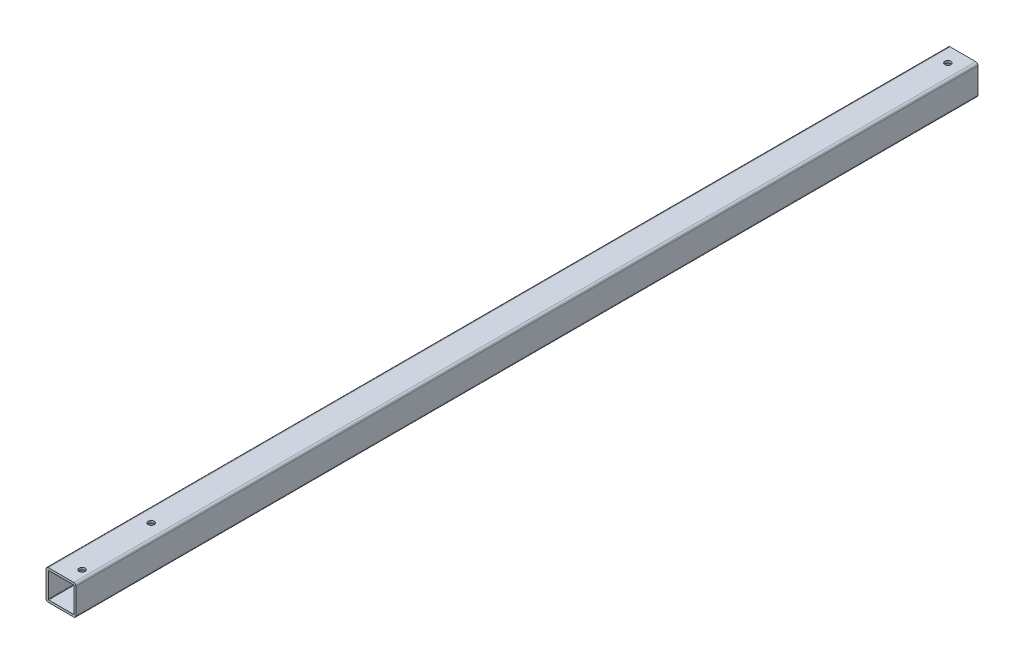
ISO-10303-21;
HEADER;
FILE_DESCRIPTION(('STEP AP214'),'2;1');
FILE_NAME('part.step','',(''),(''),'','','');
FILE_SCHEMA(('AUTOMOTIVE_DESIGN { 1 0 10303 214 1 1 1 1 }'));
ENDSEC;
DATA;
#1=APPLICATION_CONTEXT('core data for automotive mechanical design processes');
#2=APPLICATION_PROTOCOL_DEFINITION('international standard','automotive_design',2000,#1);
#3=PRODUCT_CONTEXT('',#1,'mechanical');
#4=PRODUCT('Part','Part','',(#3));
#5=PRODUCT_RELATED_PRODUCT_CATEGORY('part','',(#4));
#6=PRODUCT_DEFINITION_FORMATION('','',#4);
#7=PRODUCT_DEFINITION_CONTEXT('part definition',#1,'design');
#8=PRODUCT_DEFINITION('design','',#6,#7);
#9=PRODUCT_DEFINITION_SHAPE('','',#8);
#10=(LENGTH_UNIT() NAMED_UNIT(*) SI_UNIT(.MILLI.,.METRE.));
#11=(NAMED_UNIT(*) PLANE_ANGLE_UNIT() SI_UNIT($,.RADIAN.));
#12=(NAMED_UNIT(*) SI_UNIT($,.STERADIAN.) SOLID_ANGLE_UNIT());
#13=UNCERTAINTY_MEASURE_WITH_UNIT(LENGTH_MEASURE(1.E-05),#10,'distance_accuracy_value','');
#14=(GEOMETRIC_REPRESENTATION_CONTEXT(3) GLOBAL_UNCERTAINTY_ASSIGNED_CONTEXT((#13)) GLOBAL_UNIT_ASSIGNED_CONTEXT((#10,
#11,#12)) REPRESENTATION_CONTEXT('',''));
#15=CARTESIAN_POINT('',(0.,0.,0.));
#16=DIRECTION('',(0.,0.,1.));
#17=DIRECTION('',(1.,0.,0.));
#18=AXIS2_PLACEMENT_3D('',#15,#16,#17);
#19=CARTESIAN_POINT('',(0.,0.,1200.));
#20=DIRECTION('',(0.,0.,1.));
#21=DIRECTION('',(1.,0.,0.));
#22=AXIS2_PLACEMENT_3D('',#19,#20,#21);
#23=PLANE('',#22);
#24=DIRECTION('',(1.,0.,0.));
#25=VECTOR('',#24,1.);
#26=CARTESIAN_POINT('',(-20.,-20.,1200.));
#27=LINE('',#26,#25);
#28=CARTESIAN_POINT('',(-17.,-20.,1200.));
#29=VERTEX_POINT('',#28);
#30=CARTESIAN_POINT('',(17.,-20.,1200.));
#31=VERTEX_POINT('',#30);
#32=EDGE_CURVE('E199',#29,#31,#27,.T.);
#33=ORIENTED_EDGE('',*,*,#32,.T.);
#34=CARTESIAN_POINT('',(17.,-17.,1200.));
#35=DIRECTION('',(0.,0.,1.));
#36=DIRECTION('',(1.,0.,0.));
#37=AXIS2_PLACEMENT_3D('',#34,#35,#36);
#38=CIRCLE('',#37,3.);
#39=CARTESIAN_POINT('',(20.,-17.,1200.));
#40=VERTEX_POINT('',#39);
#41=EDGE_CURVE('E258',#31,#40,#38,.T.);
#42=ORIENTED_EDGE('',*,*,#41,.T.);
#43=DIRECTION('',(0.,1.,0.));
#44=VECTOR('',#43,1.);
#45=CARTESIAN_POINT('',(20.,20.,1200.));
#46=LINE('',#45,#44);
#47=CARTESIAN_POINT('',(20.,17.,1200.));
#48=VERTEX_POINT('',#47);
#49=EDGE_CURVE('E311',#40,#48,#46,.T.);
#50=ORIENTED_EDGE('',*,*,#49,.T.);
#51=CARTESIAN_POINT('',(17.,17.,1200.));
#52=DIRECTION('',(0.,0.,1.));
#53=DIRECTION('',(1.,0.,0.));
#54=AXIS2_PLACEMENT_3D('',#51,#52,#53);
#55=CIRCLE('',#54,3.);
#56=CARTESIAN_POINT('',(17.,20.,1200.));
#57=VERTEX_POINT('',#56);
#58=EDGE_CURVE('E254',#48,#57,#55,.T.);
#59=ORIENTED_EDGE('',*,*,#58,.T.);
#60=DIRECTION('',(-1.,0.,0.));
#61=VECTOR('',#60,1.);
#62=CARTESIAN_POINT('',(-20.,20.,1200.));
#63=LINE('',#62,#61);
#64=CARTESIAN_POINT('',(-17.,20.,1200.));
#65=VERTEX_POINT('',#64);
#66=EDGE_CURVE('E314',#57,#65,#63,.T.);
#67=ORIENTED_EDGE('',*,*,#66,.T.);
#68=CARTESIAN_POINT('',(-17.,17.,1200.));
#69=DIRECTION('',(0.,0.,1.));
#70=DIRECTION('',(1.,0.,0.));
#71=AXIS2_PLACEMENT_3D('',#68,#69,#70);
#72=CIRCLE('',#71,3.);
#73=CARTESIAN_POINT('',(-20.,17.,1200.));
#74=VERTEX_POINT('',#73);
#75=EDGE_CURVE('E80',#65,#74,#72,.T.);
#76=ORIENTED_EDGE('',*,*,#75,.T.);
#77=DIRECTION('',(0.,-1.,0.));
#78=VECTOR('',#77,1.);
#79=CARTESIAN_POINT('',(-20.,20.,1200.));
#80=LINE('',#79,#78);
#81=CARTESIAN_POINT('',(-20.,-17.,1200.));
#82=VERTEX_POINT('',#81);
#83=EDGE_CURVE('E204',#74,#82,#80,.T.);
#84=ORIENTED_EDGE('',*,*,#83,.T.);
#85=CARTESIAN_POINT('',(-17.,-17.,1200.));
#86=DIRECTION('',(0.,0.,1.));
#87=DIRECTION('',(1.,0.,0.));
#88=AXIS2_PLACEMENT_3D('',#85,#86,#87);
#89=CIRCLE('',#88,3.);
#90=EDGE_CURVE('E256',#82,#29,#89,.T.);
#91=ORIENTED_EDGE('',*,*,#90,.T.);
#92=EDGE_LOOP('',(#33,#42,#50,#59,#67,#76,#84,#91));
#93=FACE_BOUND('',#92,.T.);
#94=DIRECTION('',(-1.,0.,0.));
#95=VECTOR('',#94,1.);
#96=CARTESIAN_POINT('',(-20.,17.,1200.));
#97=LINE('',#96,#95);
#98=CARTESIAN_POINT('',(16.5,17.,1200.));
#99=VERTEX_POINT('',#98);
#100=CARTESIAN_POINT('',(-16.5,17.,1200.));
#101=VERTEX_POINT('',#100);
#102=EDGE_CURVE('E298',#99,#101,#97,.T.);
#103=ORIENTED_EDGE('',*,*,#102,.F.);
#104=CARTESIAN_POINT('',(16.5,16.5,1200.));
#105=DIRECTION('',(0.,0.,1.));
#106=DIRECTION('',(1.,0.,0.));
#107=AXIS2_PLACEMENT_3D('',#104,#105,#106);
#108=CIRCLE('',#107,0.5);
#109=CARTESIAN_POINT('',(17.,16.5,1200.));
#110=VERTEX_POINT('',#109);
#111=EDGE_CURVE('E229',#99,#110,#108,.F.);
#112=ORIENTED_EDGE('',*,*,#111,.T.);
#113=DIRECTION('',(0.,1.,0.));
#114=VECTOR('',#113,1.);
#115=CARTESIAN_POINT('',(17.,20.,1200.));
#116=LINE('',#115,#114);
#117=CARTESIAN_POINT('',(17.,-16.5,1200.));
#118=VERTEX_POINT('',#117);
#119=EDGE_CURVE('E295',#118,#110,#116,.T.);
#120=ORIENTED_EDGE('',*,*,#119,.F.);
#121=CARTESIAN_POINT('',(16.5,-16.5,1200.));
#122=DIRECTION('',(0.,0.,1.));
#123=DIRECTION('',(1.,0.,0.));
#124=AXIS2_PLACEMENT_3D('',#121,#122,#123);
#125=CIRCLE('',#124,0.5);
#126=CARTESIAN_POINT('',(16.5,-17.,1200.));
#127=VERTEX_POINT('',#126);
#128=EDGE_CURVE('E233',#118,#127,#125,.F.);
#129=ORIENTED_EDGE('',*,*,#128,.T.);
#130=DIRECTION('',(1.,0.,0.));
#131=VECTOR('',#130,1.);
#132=CARTESIAN_POINT('',(-20.,-17.,1200.));
#133=LINE('',#132,#131);
#134=CARTESIAN_POINT('',(-16.5,-17.,1200.));
#135=VERTEX_POINT('',#134);
#136=EDGE_CURVE('E303',#135,#127,#133,.T.);
#137=ORIENTED_EDGE('',*,*,#136,.F.);
#138=CARTESIAN_POINT('',(-16.5,-16.5,1200.));
#139=DIRECTION('',(0.,0.,1.));
#140=DIRECTION('',(1.,0.,0.));
#141=AXIS2_PLACEMENT_3D('',#138,#139,#140);
#142=CIRCLE('',#141,0.5);
#143=CARTESIAN_POINT('',(-17.,-16.5,1200.));
#144=VERTEX_POINT('',#143);
#145=EDGE_CURVE('E185',#135,#144,#142,.F.);
#146=ORIENTED_EDGE('',*,*,#145,.T.);
#147=DIRECTION('',(0.,-1.,0.));
#148=VECTOR('',#147,1.);
#149=CARTESIAN_POINT('',(-17.,20.,1200.));
#150=LINE('',#149,#148);
#151=CARTESIAN_POINT('',(-17.,16.5,1200.));
#152=VERTEX_POINT('',#151);
#153=EDGE_CURVE('E301',#152,#144,#150,.T.);
#154=ORIENTED_EDGE('',*,*,#153,.F.);
#155=CARTESIAN_POINT('',(-16.5,16.5,1200.));
#156=DIRECTION('',(0.,0.,1.));
#157=DIRECTION('',(1.,0.,0.));
#158=AXIS2_PLACEMENT_3D('',#155,#156,#157);
#159=CIRCLE('',#158,0.5);
#160=EDGE_CURVE('E184',#152,#101,#159,.F.);
#161=ORIENTED_EDGE('',*,*,#160,.T.);
#162=EDGE_LOOP('',(#103,#112,#120,#129,#137,#146,#154,#161));
#163=FACE_BOUND('',#162,.T.);
#164=ADVANCED_FACE('F56',(#93,#163),#23,.T.);
#165=CARTESIAN_POINT('',(0.,0.,0.));
#166=DIRECTION('',(0.,0.,1.));
#167=DIRECTION('',(1.,0.,0.));
#168=AXIS2_PLACEMENT_3D('',#165,#166,#167);
#169=PLANE('',#168);
#170=DIRECTION('',(0.,1.,0.));
#171=VECTOR('',#170,1.);
#172=CARTESIAN_POINT('',(20.,20.,0.));
#173=LINE('',#172,#171);
#174=CARTESIAN_POINT('',(20.,-17.,0.));
#175=VERTEX_POINT('',#174);
#176=CARTESIAN_POINT('',(20.,17.,0.));
#177=VERTEX_POINT('',#176);
#178=EDGE_CURVE('E306',#175,#177,#173,.T.);
#179=ORIENTED_EDGE('',*,*,#178,.F.);
#180=CARTESIAN_POINT('',(17.,-17.,0.));
#181=DIRECTION('',(0.,0.,1.));
#182=DIRECTION('',(1.,0.,0.));
#183=AXIS2_PLACEMENT_3D('',#180,#181,#182);
#184=CIRCLE('',#183,3.);
#185=CARTESIAN_POINT('',(17.,-20.,0.));
#186=VERTEX_POINT('',#185);
#187=EDGE_CURVE('E246',#175,#186,#184,.F.);
#188=ORIENTED_EDGE('',*,*,#187,.T.);
#189=DIRECTION('',(1.,0.,0.));
#190=VECTOR('',#189,1.);
#191=CARTESIAN_POINT('',(-20.,-20.,0.));
#192=LINE('',#191,#190);
#193=CARTESIAN_POINT('',(-17.,-20.,0.));
#194=VERTEX_POINT('',#193);
#195=EDGE_CURVE('E207',#194,#186,#192,.T.);
#196=ORIENTED_EDGE('',*,*,#195,.F.);
#197=CARTESIAN_POINT('',(-17.,-17.,0.));
#198=DIRECTION('',(0.,0.,1.));
#199=DIRECTION('',(1.,0.,0.));
#200=AXIS2_PLACEMENT_3D('',#197,#198,#199);
#201=CIRCLE('',#200,3.);
#202=CARTESIAN_POINT('',(-20.,-17.,0.));
#203=VERTEX_POINT('',#202);
#204=EDGE_CURVE('E244',#194,#203,#201,.F.);
#205=ORIENTED_EDGE('',*,*,#204,.T.);
#206=DIRECTION('',(0.,-1.,0.));
#207=VECTOR('',#206,1.);
#208=CARTESIAN_POINT('',(-20.,20.,0.));
#209=LINE('',#208,#207);
#210=CARTESIAN_POINT('',(-20.,17.,0.));
#211=VERTEX_POINT('',#210);
#212=EDGE_CURVE('E321',#211,#203,#209,.T.);
#213=ORIENTED_EDGE('',*,*,#212,.F.);
#214=CARTESIAN_POINT('',(-17.,17.,0.));
#215=DIRECTION('',(0.,0.,1.));
#216=DIRECTION('',(1.,0.,0.));
#217=AXIS2_PLACEMENT_3D('',#214,#215,#216);
#218=CIRCLE('',#217,3.);
#219=CARTESIAN_POINT('',(-17.,20.,0.));
#220=VERTEX_POINT('',#219);
#221=EDGE_CURVE('E240',#211,#220,#218,.F.);
#222=ORIENTED_EDGE('',*,*,#221,.T.);
#223=DIRECTION('',(-1.,0.,0.));
#224=VECTOR('',#223,1.);
#225=CARTESIAN_POINT('',(-20.,20.,0.));
#226=LINE('',#225,#224);
#227=CARTESIAN_POINT('',(17.,20.,0.));
#228=VERTEX_POINT('',#227);
#229=EDGE_CURVE('E319',#228,#220,#226,.T.);
#230=ORIENTED_EDGE('',*,*,#229,.F.);
#231=CARTESIAN_POINT('',(17.,17.,0.));
#232=DIRECTION('',(0.,0.,1.));
#233=DIRECTION('',(1.,0.,0.));
#234=AXIS2_PLACEMENT_3D('',#231,#232,#233);
#235=CIRCLE('',#234,3.);
#236=EDGE_CURVE('E242',#228,#177,#235,.F.);
#237=ORIENTED_EDGE('',*,*,#236,.T.);
#238=EDGE_LOOP('',(#179,#188,#196,#205,#213,#222,#230,#237));
#239=FACE_BOUND('',#238,.T.);
#240=DIRECTION('',(1.,0.,0.));
#241=VECTOR('',#240,1.);
#242=CARTESIAN_POINT('',(-20.,-17.,0.));
#243=LINE('',#242,#241);
#244=CARTESIAN_POINT('',(-16.5,-17.,0.));
#245=VERTEX_POINT('',#244);
#246=CARTESIAN_POINT('',(16.5,-17.,0.));
#247=VERTEX_POINT('',#246);
#248=EDGE_CURVE('E195',#245,#247,#243,.T.);
#249=ORIENTED_EDGE('',*,*,#248,.T.);
#250=CARTESIAN_POINT('',(16.5,-16.5,0.));
#251=DIRECTION('',(0.,0.,1.));
#252=DIRECTION('',(1.,0.,0.));
#253=AXIS2_PLACEMENT_3D('',#250,#251,#252);
#254=CIRCLE('',#253,0.5);
#255=CARTESIAN_POINT('',(17.,-16.5,0.));
#256=VERTEX_POINT('',#255);
#257=EDGE_CURVE('E231',#247,#256,#254,.T.);
#258=ORIENTED_EDGE('',*,*,#257,.T.);
#259=DIRECTION('',(0.,1.,0.));
#260=VECTOR('',#259,1.);
#261=CARTESIAN_POINT('',(17.,20.,0.));
#262=LINE('',#261,#260);
#263=CARTESIAN_POINT('',(17.,16.5,0.));
#264=VERTEX_POINT('',#263);
#265=EDGE_CURVE('E294',#256,#264,#262,.T.);
#266=ORIENTED_EDGE('',*,*,#265,.T.);
#267=CARTESIAN_POINT('',(16.5,16.5,0.));
#268=DIRECTION('',(0.,0.,1.));
#269=DIRECTION('',(1.,0.,0.));
#270=AXIS2_PLACEMENT_3D('',#267,#268,#269);
#271=CIRCLE('',#270,0.5);
#272=CARTESIAN_POINT('',(16.5,17.,0.));
#273=VERTEX_POINT('',#272);
#274=EDGE_CURVE('E227',#264,#273,#271,.T.);
#275=ORIENTED_EDGE('',*,*,#274,.T.);
#276=DIRECTION('',(-1.,0.,0.));
#277=VECTOR('',#276,1.);
#278=CARTESIAN_POINT('',(-20.,17.,0.));
#279=LINE('',#278,#277);
#280=CARTESIAN_POINT('',(-16.5,17.,0.));
#281=VERTEX_POINT('',#280);
#282=EDGE_CURVE('E179',#273,#281,#279,.T.);
#283=ORIENTED_EDGE('',*,*,#282,.T.);
#284=CARTESIAN_POINT('',(-16.5,16.5,0.));
#285=DIRECTION('',(0.,0.,1.));
#286=DIRECTION('',(1.,0.,0.));
#287=AXIS2_PLACEMENT_3D('',#284,#285,#286);
#288=CIRCLE('',#287,0.5);
#289=CARTESIAN_POINT('',(-17.,16.5,0.));
#290=VERTEX_POINT('',#289);
#291=EDGE_CURVE('E173',#281,#290,#288,.T.);
#292=ORIENTED_EDGE('',*,*,#291,.T.);
#293=DIRECTION('',(0.,-1.,0.));
#294=VECTOR('',#293,1.);
#295=CARTESIAN_POINT('',(-17.,20.,0.));
#296=LINE('',#295,#294);
#297=CARTESIAN_POINT('',(-17.,-16.5,0.));
#298=VERTEX_POINT('',#297);
#299=EDGE_CURVE('E177',#290,#298,#296,.T.);
#300=ORIENTED_EDGE('',*,*,#299,.T.);
#301=CARTESIAN_POINT('',(-16.5,-16.5,0.));
#302=DIRECTION('',(0.,0.,1.));
#303=DIRECTION('',(1.,0.,0.));
#304=AXIS2_PLACEMENT_3D('',#301,#302,#303);
#305=CIRCLE('',#304,0.5);
#306=EDGE_CURVE('E223',#298,#245,#305,.T.);
#307=ORIENTED_EDGE('',*,*,#306,.T.);
#308=EDGE_LOOP('',(#249,#258,#266,#275,#283,#292,#300,#307));
#309=FACE_BOUND('',#308,.T.);
#310=ADVANCED_FACE('F176',(#239,#309),#169,.F.);
#311=CARTESIAN_POINT('',(20.,20.,1200.));
#312=DIRECTION('',(-1.,0.,0.));
#313=DIRECTION('',(0.,-1.,0.));
#314=AXIS2_PLACEMENT_3D('',#311,#312,#313);
#315=PLANE('',#314);
#316=ORIENTED_EDGE('',*,*,#49,.F.);
#317=DIRECTION('',(0.,0.,-1.));
#318=VECTOR('',#317,1.);
#319=CARTESIAN_POINT('',(20.,-17.,1200.));
#320=LINE('',#319,#318);
#321=EDGE_CURVE('E237',#40,#175,#320,.T.);
#322=ORIENTED_EDGE('',*,*,#321,.T.);
#323=ORIENTED_EDGE('',*,*,#178,.T.);
#324=DIRECTION('',(0.,0.,-1.));
#325=VECTOR('',#324,1.);
#326=CARTESIAN_POINT('',(20.,17.,1200.));
#327=LINE('',#326,#325);
#328=EDGE_CURVE('E235',#177,#48,#327,.F.);
#329=ORIENTED_EDGE('',*,*,#328,.T.);
#330=EDGE_LOOP('',(#316,#322,#323,#329));
#331=FACE_BOUND('',#330,.T.);
#332=ADVANCED_FACE('F339',(#331),#315,.F.);
#333=CARTESIAN_POINT('',(-20.,20.,1200.));
#334=DIRECTION('',(0.,-1.,0.));
#335=DIRECTION('',(0.,0.,-1.));
#336=AXIS2_PLACEMENT_3D('',#333,#334,#335);
#337=PLANE('',#336);
#338=CARTESIAN_POINT('',(8.,20.,1180.));
#339=DIRECTION('',(0.,1.,0.));
#340=DIRECTION('',(0.,0.,1.));
#341=AXIS2_PLACEMENT_3D('',#338,#339,#340);
#342=CIRCLE('',#341,3.99999999999999);
#343=CARTESIAN_POINT('',(8.,20.,1184.));
#344=VERTEX_POINT('',#343);
#345=EDGE_CURVE('E456',#344,#344,#342,.T.);
#346=ORIENTED_EDGE('',*,*,#345,.F.);
#347=EDGE_LOOP('',(#346));
#348=FACE_BOUND('',#347,.T.);
#349=CARTESIAN_POINT('',(0.,20.,20.));
#350=DIRECTION('',(0.,1.,0.));
#351=DIRECTION('',(0.,0.,1.));
#352=AXIS2_PLACEMENT_3D('',#349,#350,#351);
#353=CIRCLE('',#352,3.99999999999999);
#354=CARTESIAN_POINT('',(0.,20.,24.));
#355=VERTEX_POINT('',#354);
#356=EDGE_CURVE('E274',#355,#355,#353,.T.);
#357=ORIENTED_EDGE('',*,*,#356,.F.);
#358=EDGE_LOOP('',(#357));
#359=FACE_BOUND('',#358,.T.);
#360=CARTESIAN_POINT('',(1.32261854307914E-13,20.,1080.));
#361=DIRECTION('',(0.,1.,0.));
#362=DIRECTION('',(0.,0.,1.));
#363=AXIS2_PLACEMENT_3D('',#360,#361,#362);
#364=CIRCLE('',#363,3.99999999999999);
#365=CARTESIAN_POINT('',(1.32261854307914E-13,20.,1084.));
#366=VERTEX_POINT('',#365);
#367=EDGE_CURVE('E271',#366,#366,#364,.T.);
#368=ORIENTED_EDGE('',*,*,#367,.F.);
#369=EDGE_LOOP('',(#368));
#370=FACE_BOUND('',#369,.T.);
#371=ORIENTED_EDGE('',*,*,#66,.F.);
#372=DIRECTION('',(0.,0.,-1.));
#373=VECTOR('',#372,1.);
#374=CARTESIAN_POINT('',(17.,20.,1200.));
#375=LINE('',#374,#373);
#376=EDGE_CURVE('E12',#57,#228,#375,.T.);
#377=ORIENTED_EDGE('',*,*,#376,.T.);
#378=ORIENTED_EDGE('',*,*,#229,.T.);
#379=DIRECTION('',(0.,0.,-1.));
#380=VECTOR('',#379,1.);
#381=CARTESIAN_POINT('',(-17.,20.,1200.));
#382=LINE('',#381,#380);
#383=EDGE_CURVE('E65',#220,#65,#382,.F.);
#384=ORIENTED_EDGE('',*,*,#383,.T.);
#385=EDGE_LOOP('',(#371,#377,#378,#384));
#386=FACE_BOUND('',#385,.T.);
#387=ADVANCED_FACE('F347',(#348,#359,#370,#386),#337,.F.);
#388=CARTESIAN_POINT('',(-20.,20.,1200.));
#389=DIRECTION('',(1.,0.,0.));
#390=DIRECTION('',(0.,1.,0.));
#391=AXIS2_PLACEMENT_3D('',#388,#389,#390);
#392=PLANE('',#391);
#393=ORIENTED_EDGE('',*,*,#212,.T.);
#394=DIRECTION('',(0.,0.,-1.));
#395=VECTOR('',#394,1.);
#396=CARTESIAN_POINT('',(-20.,-17.,1200.));
#397=LINE('',#396,#395);
#398=EDGE_CURVE('E73',#203,#82,#397,.F.);
#399=ORIENTED_EDGE('',*,*,#398,.T.);
#400=ORIENTED_EDGE('',*,*,#83,.F.);
#401=DIRECTION('',(0.,0.,-1.));
#402=VECTOR('',#401,1.);
#403=CARTESIAN_POINT('',(-20.,17.,1200.));
#404=LINE('',#403,#402);
#405=EDGE_CURVE('E260',#74,#211,#404,.T.);
#406=ORIENTED_EDGE('',*,*,#405,.T.);
#407=EDGE_LOOP('',(#393,#399,#400,#406));
#408=FACE_BOUND('',#407,.T.);
#409=ADVANCED_FACE('F352',(#408),#392,.F.);
#410=CARTESIAN_POINT('',(-20.,-20.,1200.));
#411=DIRECTION('',(0.,1.,0.));
#412=DIRECTION('',(0.,0.,1.));
#413=AXIS2_PLACEMENT_3D('',#410,#411,#412);
#414=PLANE('',#413);
#415=CARTESIAN_POINT('',(8.,-20.,1180.));
#416=DIRECTION('',(0.,1.,0.));
#417=DIRECTION('',(0.,0.,1.));
#418=AXIS2_PLACEMENT_3D('',#415,#416,#417);
#419=CIRCLE('',#418,3.99999999999999);
#420=CARTESIAN_POINT('',(8.,-20.,1184.));
#421=VERTEX_POINT('',#420);
#422=EDGE_CURVE('E455',#421,#421,#419,.T.);
#423=ORIENTED_EDGE('',*,*,#422,.T.);
#424=EDGE_LOOP('',(#423));
#425=FACE_BOUND('',#424,.T.);
#426=CARTESIAN_POINT('',(0.,-20.,20.));
#427=DIRECTION('',(0.,1.,0.));
#428=DIRECTION('',(0.,0.,1.));
#429=AXIS2_PLACEMENT_3D('',#426,#427,#428);
#430=CIRCLE('',#429,3.99999999999999);
#431=CARTESIAN_POINT('',(0.,-20.,24.));
#432=VERTEX_POINT('',#431);
#433=EDGE_CURVE('E267',#432,#432,#430,.T.);
#434=ORIENTED_EDGE('',*,*,#433,.T.);
#435=EDGE_LOOP('',(#434));
#436=FACE_BOUND('',#435,.T.);
#437=CARTESIAN_POINT('',(1.32261854307914E-13,-20.,1080.));
#438=DIRECTION('',(0.,1.,0.));
#439=DIRECTION('',(0.,0.,1.));
#440=AXIS2_PLACEMENT_3D('',#437,#438,#439);
#441=CIRCLE('',#440,3.99999999999999);
#442=CARTESIAN_POINT('',(1.32261854307914E-13,-20.,1084.));
#443=VERTEX_POINT('',#442);
#444=EDGE_CURVE('E285',#443,#443,#441,.T.);
#445=ORIENTED_EDGE('',*,*,#444,.T.);
#446=EDGE_LOOP('',(#445));
#447=FACE_BOUND('',#446,.T.);
#448=ORIENTED_EDGE('',*,*,#195,.T.);
#449=DIRECTION('',(0.,0.,-1.));
#450=VECTOR('',#449,1.);
#451=CARTESIAN_POINT('',(17.,-20.,1200.));
#452=LINE('',#451,#450);
#453=EDGE_CURVE('E251',#186,#31,#452,.F.);
#454=ORIENTED_EDGE('',*,*,#453,.T.);
#455=ORIENTED_EDGE('',*,*,#32,.F.);
#456=DIRECTION('',(0.,0.,-1.));
#457=VECTOR('',#456,1.);
#458=CARTESIAN_POINT('',(-17.,-20.,1200.));
#459=LINE('',#458,#457);
#460=EDGE_CURVE('E248',#29,#194,#459,.T.);
#461=ORIENTED_EDGE('',*,*,#460,.T.);
#462=EDGE_LOOP('',(#448,#454,#455,#461));
#463=FACE_BOUND('',#462,.T.);
#464=ADVANCED_FACE('F327',(#425,#436,#447,#463),#414,.F.);
#465=CARTESIAN_POINT('',(17.,20.,1200.));
#466=DIRECTION('',(-1.,0.,0.));
#467=DIRECTION('',(0.,-1.,0.));
#468=AXIS2_PLACEMENT_3D('',#465,#466,#467);
#469=PLANE('',#468);
#470=ORIENTED_EDGE('',*,*,#119,.T.);
#471=DIRECTION('',(0.,0.,-1.));
#472=VECTOR('',#471,1.);
#473=CARTESIAN_POINT('',(17.,16.5,0.));
#474=LINE('',#473,#472);
#475=EDGE_CURVE('E220',#110,#264,#474,.T.);
#476=ORIENTED_EDGE('',*,*,#475,.T.);
#477=ORIENTED_EDGE('',*,*,#265,.F.);
#478=DIRECTION('',(0.,0.,-1.));
#479=VECTOR('',#478,1.);
#480=CARTESIAN_POINT('',(17.,-16.5,1200.));
#481=LINE('',#480,#479);
#482=EDGE_CURVE('E218',#256,#118,#481,.F.);
#483=ORIENTED_EDGE('',*,*,#482,.T.);
#484=EDGE_LOOP('',(#470,#476,#477,#483));
#485=FACE_BOUND('',#484,.T.);
#486=ADVANCED_FACE('F371',(#485),#469,.T.);
#487=CARTESIAN_POINT('',(-20.,17.,1200.));
#488=DIRECTION('',(0.,-1.,0.));
#489=DIRECTION('',(0.,0.,-1.));
#490=AXIS2_PLACEMENT_3D('',#487,#488,#489);
#491=PLANE('',#490);
#492=CARTESIAN_POINT('',(8.,17.,1180.));
#493=DIRECTION('',(0.,-1.,0.));
#494=DIRECTION('',(0.,0.,-1.));
#495=AXIS2_PLACEMENT_3D('',#492,#493,#494);
#496=CIRCLE('',#495,3.99999999999999);
#497=CARTESIAN_POINT('',(8.,17.,1176.));
#498=VERTEX_POINT('',#497);
#499=EDGE_CURVE('E279',#498,#498,#496,.T.);
#500=ORIENTED_EDGE('',*,*,#499,.F.);
#501=EDGE_LOOP('',(#500));
#502=FACE_BOUND('',#501,.T.);
#503=CARTESIAN_POINT('',(0.,17.,20.));
#504=DIRECTION('',(0.,-1.,0.));
#505=DIRECTION('',(0.,0.,-1.));
#506=AXIS2_PLACEMENT_3D('',#503,#504,#505);
#507=CIRCLE('',#506,3.99999999999999);
#508=CARTESIAN_POINT('',(0.,17.,16.));
#509=VERTEX_POINT('',#508);
#510=EDGE_CURVE('E266',#509,#509,#507,.T.);
#511=ORIENTED_EDGE('',*,*,#510,.F.);
#512=EDGE_LOOP('',(#511));
#513=FACE_BOUND('',#512,.T.);
#514=CARTESIAN_POINT('',(1.32261854307914E-13,17.,1080.));
#515=DIRECTION('',(0.,-1.,0.));
#516=DIRECTION('',(0.,0.,-1.));
#517=AXIS2_PLACEMENT_3D('',#514,#515,#516);
#518=CIRCLE('',#517,3.99999999999999);
#519=CARTESIAN_POINT('',(1.32261854307914E-13,17.,1076.));
#520=VERTEX_POINT('',#519);
#521=EDGE_CURVE('E291',#520,#520,#518,.T.);
#522=ORIENTED_EDGE('',*,*,#521,.F.);
#523=EDGE_LOOP('',(#522));
#524=FACE_BOUND('',#523,.T.);
#525=ORIENTED_EDGE('',*,*,#102,.T.);
#526=DIRECTION('',(0.,0.,-1.));
#527=VECTOR('',#526,1.);
#528=CARTESIAN_POINT('',(-16.5,17.,0.));
#529=LINE('',#528,#527);
#530=EDGE_CURVE('E216',#101,#281,#529,.T.);
#531=ORIENTED_EDGE('',*,*,#530,.T.);
#532=ORIENTED_EDGE('',*,*,#282,.F.);
#533=DIRECTION('',(0.,0.,-1.));
#534=VECTOR('',#533,1.);
#535=CARTESIAN_POINT('',(16.5,17.,1200.));
#536=LINE('',#535,#534);
#537=EDGE_CURVE('E214',#273,#99,#536,.F.);
#538=ORIENTED_EDGE('',*,*,#537,.T.);
#539=EDGE_LOOP('',(#525,#531,#532,#538));
#540=FACE_BOUND('',#539,.T.);
#541=ADVANCED_FACE('F411',(#502,#513,#524,#540),#491,.T.);
#542=CARTESIAN_POINT('',(-17.,20.,1200.));
#543=DIRECTION('',(1.,0.,0.));
#544=DIRECTION('',(0.,1.,0.));
#545=AXIS2_PLACEMENT_3D('',#542,#543,#544);
#546=PLANE('',#545);
#547=ORIENTED_EDGE('',*,*,#153,.T.);
#548=DIRECTION('',(0.,0.,-1.));
#549=VECTOR('',#548,1.);
#550=CARTESIAN_POINT('',(-17.,-16.5,0.));
#551=LINE('',#550,#549);
#552=EDGE_CURVE('E194',#144,#298,#551,.T.);
#553=ORIENTED_EDGE('',*,*,#552,.T.);
#554=ORIENTED_EDGE('',*,*,#299,.F.);
#555=DIRECTION('',(0.,0.,-1.));
#556=VECTOR('',#555,1.);
#557=CARTESIAN_POINT('',(-17.,16.5,1200.));
#558=LINE('',#557,#556);
#559=EDGE_CURVE('E191',#290,#152,#558,.F.);
#560=ORIENTED_EDGE('',*,*,#559,.T.);
#561=EDGE_LOOP('',(#547,#553,#554,#560));
#562=FACE_BOUND('',#561,.T.);
#563=ADVANCED_FACE('F190',(#562),#546,.T.);
#564=CARTESIAN_POINT('',(-20.,-17.,1200.));
#565=DIRECTION('',(0.,1.,0.));
#566=DIRECTION('',(0.,0.,1.));
#567=AXIS2_PLACEMENT_3D('',#564,#565,#566);
#568=PLANE('',#567);
#569=CARTESIAN_POINT('',(8.,-17.,1180.));
#570=DIRECTION('',(0.,1.,0.));
#571=DIRECTION('',(0.,0.,1.));
#572=AXIS2_PLACEMENT_3D('',#569,#570,#571);
#573=CIRCLE('',#572,3.99999999999999);
#574=CARTESIAN_POINT('',(8.,-17.,1184.));
#575=VERTEX_POINT('',#574);
#576=EDGE_CURVE('E60',#575,#575,#573,.T.);
#577=ORIENTED_EDGE('',*,*,#576,.F.);
#578=EDGE_LOOP('',(#577));
#579=FACE_BOUND('',#578,.T.);
#580=CARTESIAN_POINT('',(0.,-17.,20.));
#581=DIRECTION('',(0.,1.,0.));
#582=DIRECTION('',(0.,0.,1.));
#583=AXIS2_PLACEMENT_3D('',#580,#581,#582);
#584=CIRCLE('',#583,3.99999999999999);
#585=CARTESIAN_POINT('',(0.,-17.,24.));
#586=VERTEX_POINT('',#585);
#587=EDGE_CURVE('E264',#586,#586,#584,.T.);
#588=ORIENTED_EDGE('',*,*,#587,.F.);
#589=EDGE_LOOP('',(#588));
#590=FACE_BOUND('',#589,.T.);
#591=CARTESIAN_POINT('',(1.32261854307914E-13,-17.,1080.));
#592=DIRECTION('',(0.,1.,0.));
#593=DIRECTION('',(0.,0.,1.));
#594=AXIS2_PLACEMENT_3D('',#591,#592,#593);
#595=CIRCLE('',#594,3.99999999999999);
#596=CARTESIAN_POINT('',(1.32261854307914E-13,-17.,1084.));
#597=VERTEX_POINT('',#596);
#598=EDGE_CURVE('E288',#597,#597,#595,.T.);
#599=ORIENTED_EDGE('',*,*,#598,.F.);
#600=EDGE_LOOP('',(#599));
#601=FACE_BOUND('',#600,.T.);
#602=ORIENTED_EDGE('',*,*,#248,.F.);
#603=DIRECTION('',(0.,0.,-1.));
#604=VECTOR('',#603,1.);
#605=CARTESIAN_POINT('',(-16.5,-17.,1200.));
#606=LINE('',#605,#604);
#607=EDGE_CURVE('E212',#245,#135,#606,.F.);
#608=ORIENTED_EDGE('',*,*,#607,.T.);
#609=ORIENTED_EDGE('',*,*,#136,.T.);
#610=DIRECTION('',(0.,0.,-1.));
#611=VECTOR('',#610,1.);
#612=CARTESIAN_POINT('',(16.5,-17.,0.));
#613=LINE('',#612,#611);
#614=EDGE_CURVE('E201',#127,#247,#613,.T.);
#615=ORIENTED_EDGE('',*,*,#614,.T.);
#616=EDGE_LOOP('',(#602,#608,#609,#615));
#617=FACE_BOUND('',#616,.T.);
#618=ADVANCED_FACE('F387',(#579,#590,#601,#617),#568,.T.);
#619=CARTESIAN_POINT('',(-16.5,-16.5,1200.));
#620=DIRECTION('',(0.,0.,1.));
#621=DIRECTION('',(1.,0.,0.));
#622=AXIS2_PLACEMENT_3D('',#619,#620,#621);
#623=CYLINDRICAL_SURFACE('',#622,0.5);
#624=ORIENTED_EDGE('',*,*,#145,.F.);
#625=ORIENTED_EDGE('',*,*,#607,.F.);
#626=ORIENTED_EDGE('',*,*,#306,.F.);
#627=ORIENTED_EDGE('',*,*,#552,.F.);
#628=EDGE_LOOP('',(#624,#625,#626,#627));
#629=FACE_BOUND('',#628,.T.);
#630=ADVANCED_FACE('F384',(#629),#623,.F.);
#631=CARTESIAN_POINT('',(-16.5,16.5,1200.));
#632=DIRECTION('',(0.,0.,1.));
#633=DIRECTION('',(1.,0.,0.));
#634=AXIS2_PLACEMENT_3D('',#631,#632,#633);
#635=CYLINDRICAL_SURFACE('',#634,0.5);
#636=ORIENTED_EDGE('',*,*,#160,.F.);
#637=ORIENTED_EDGE('',*,*,#559,.F.);
#638=ORIENTED_EDGE('',*,*,#291,.F.);
#639=ORIENTED_EDGE('',*,*,#530,.F.);
#640=EDGE_LOOP('',(#636,#637,#638,#639));
#641=FACE_BOUND('',#640,.T.);
#642=ADVANCED_FACE('F198',(#641),#635,.F.);
#643=CARTESIAN_POINT('',(16.5,16.5,1200.));
#644=DIRECTION('',(0.,0.,1.));
#645=DIRECTION('',(1.,0.,0.));
#646=AXIS2_PLACEMENT_3D('',#643,#644,#645);
#647=CYLINDRICAL_SURFACE('',#646,0.5);
#648=ORIENTED_EDGE('',*,*,#111,.F.);
#649=ORIENTED_EDGE('',*,*,#537,.F.);
#650=ORIENTED_EDGE('',*,*,#274,.F.);
#651=ORIENTED_EDGE('',*,*,#475,.F.);
#652=EDGE_LOOP('',(#648,#649,#650,#651));
#653=FACE_BOUND('',#652,.T.);
#654=ADVANCED_FACE('F391',(#653),#647,.F.);
#655=CARTESIAN_POINT('',(16.5,-16.5,1200.));
#656=DIRECTION('',(0.,0.,1.));
#657=DIRECTION('',(1.,0.,0.));
#658=AXIS2_PLACEMENT_3D('',#655,#656,#657);
#659=CYLINDRICAL_SURFACE('',#658,0.5);
#660=ORIENTED_EDGE('',*,*,#128,.F.);
#661=ORIENTED_EDGE('',*,*,#482,.F.);
#662=ORIENTED_EDGE('',*,*,#257,.F.);
#663=ORIENTED_EDGE('',*,*,#614,.F.);
#664=EDGE_LOOP('',(#660,#661,#662,#663));
#665=FACE_BOUND('',#664,.T.);
#666=ADVANCED_FACE('F362',(#665),#659,.F.);
#667=CARTESIAN_POINT('',(17.,-17.,1200.));
#668=DIRECTION('',(0.,0.,-1.));
#669=DIRECTION('',(-1.,0.,0.));
#670=AXIS2_PLACEMENT_3D('',#667,#668,#669);
#671=CYLINDRICAL_SURFACE('',#670,3.);
#672=ORIENTED_EDGE('',*,*,#41,.F.);
#673=ORIENTED_EDGE('',*,*,#453,.F.);
#674=ORIENTED_EDGE('',*,*,#187,.F.);
#675=ORIENTED_EDGE('',*,*,#321,.F.);
#676=EDGE_LOOP('',(#672,#673,#674,#675));
#677=FACE_BOUND('',#676,.T.);
#678=ADVANCED_FACE('F333',(#677),#671,.T.);
#679=CARTESIAN_POINT('',(-17.,-17.,1200.));
#680=DIRECTION('',(0.,0.,-1.));
#681=DIRECTION('',(-1.,0.,0.));
#682=AXIS2_PLACEMENT_3D('',#679,#680,#681);
#683=CYLINDRICAL_SURFACE('',#682,3.);
#684=ORIENTED_EDGE('',*,*,#90,.F.);
#685=ORIENTED_EDGE('',*,*,#398,.F.);
#686=ORIENTED_EDGE('',*,*,#204,.F.);
#687=ORIENTED_EDGE('',*,*,#460,.F.);
#688=EDGE_LOOP('',(#684,#685,#686,#687));
#689=FACE_BOUND('',#688,.T.);
#690=ADVANCED_FACE('F355',(#689),#683,.T.);
#691=CARTESIAN_POINT('',(17.,17.,1200.));
#692=DIRECTION('',(0.,0.,-1.));
#693=DIRECTION('',(-1.,0.,0.));
#694=AXIS2_PLACEMENT_3D('',#691,#692,#693);
#695=CYLINDRICAL_SURFACE('',#694,3.);
#696=ORIENTED_EDGE('',*,*,#58,.F.);
#697=ORIENTED_EDGE('',*,*,#328,.F.);
#698=ORIENTED_EDGE('',*,*,#236,.F.);
#699=ORIENTED_EDGE('',*,*,#376,.F.);
#700=EDGE_LOOP('',(#696,#697,#698,#699));
#701=FACE_BOUND('',#700,.T.);
#702=ADVANCED_FACE('F343',(#701),#695,.T.);
#703=CARTESIAN_POINT('',(-17.,17.,1200.));
#704=DIRECTION('',(0.,0.,-1.));
#705=DIRECTION('',(-1.,0.,0.));
#706=AXIS2_PLACEMENT_3D('',#703,#704,#705);
#707=CYLINDRICAL_SURFACE('',#706,3.);
#708=ORIENTED_EDGE('',*,*,#75,.F.);
#709=ORIENTED_EDGE('',*,*,#383,.F.);
#710=ORIENTED_EDGE('',*,*,#221,.F.);
#711=ORIENTED_EDGE('',*,*,#405,.F.);
#712=EDGE_LOOP('',(#708,#709,#710,#711));
#713=FACE_BOUND('',#712,.T.);
#714=ADVANCED_FACE('F58',(#713),#707,.T.);
#715=CARTESIAN_POINT('',(1.32261854307914E-13,20.,1080.));
#716=DIRECTION('',(0.,1.,0.));
#717=DIRECTION('',(0.,0.,1.));
#718=AXIS2_PLACEMENT_3D('',#715,#716,#717);
#719=CYLINDRICAL_SURFACE('',#718,3.99999999999999);
#720=ORIENTED_EDGE('',*,*,#598,.T.);
#721=EDGE_LOOP('',(#720));
#722=FACE_BOUND('',#721,.T.);
#723=ORIENTED_EDGE('',*,*,#444,.F.);
#724=EDGE_LOOP('',(#723));
#725=FACE_BOUND('',#724,.T.);
#726=ADVANCED_FACE('F431',(#722,#725),#719,.F.);
#727=ORIENTED_EDGE('',*,*,#521,.T.);
#728=EDGE_LOOP('',(#727));
#729=FACE_BOUND('',#728,.T.);
#730=ORIENTED_EDGE('',*,*,#367,.T.);
#731=EDGE_LOOP('',(#730));
#732=FACE_BOUND('',#731,.T.);
#733=ADVANCED_FACE('F434',(#729,#732),#719,.F.);
#734=CARTESIAN_POINT('',(0.,20.,20.));
#735=DIRECTION('',(0.,1.,0.));
#736=DIRECTION('',(0.,0.,1.));
#737=AXIS2_PLACEMENT_3D('',#734,#735,#736);
#738=CYLINDRICAL_SURFACE('',#737,3.99999999999999);
#739=ORIENTED_EDGE('',*,*,#587,.T.);
#740=EDGE_LOOP('',(#739));
#741=FACE_BOUND('',#740,.T.);
#742=ORIENTED_EDGE('',*,*,#433,.F.);
#743=EDGE_LOOP('',(#742));
#744=FACE_BOUND('',#743,.T.);
#745=ADVANCED_FACE('F436',(#741,#744),#738,.F.);
#746=ORIENTED_EDGE('',*,*,#510,.T.);
#747=EDGE_LOOP('',(#746));
#748=FACE_BOUND('',#747,.T.);
#749=ORIENTED_EDGE('',*,*,#356,.T.);
#750=EDGE_LOOP('',(#749));
#751=FACE_BOUND('',#750,.T.);
#752=ADVANCED_FACE('F439',(#748,#751),#738,.F.);
#753=CARTESIAN_POINT('',(8.,20.,1180.));
#754=DIRECTION('',(0.,1.,0.));
#755=DIRECTION('',(0.,0.,1.));
#756=AXIS2_PLACEMENT_3D('',#753,#754,#755);
#757=CYLINDRICAL_SURFACE('',#756,3.99999999999999);
#758=ORIENTED_EDGE('',*,*,#576,.T.);
#759=EDGE_LOOP('',(#758));
#760=FACE_BOUND('',#759,.T.);
#761=ORIENTED_EDGE('',*,*,#422,.F.);
#762=EDGE_LOOP('',(#761));
#763=FACE_BOUND('',#762,.T.);
#764=ADVANCED_FACE('F440',(#760,#763),#757,.F.);
#765=ORIENTED_EDGE('',*,*,#499,.T.);
#766=EDGE_LOOP('',(#765));
#767=FACE_BOUND('',#766,.T.);
#768=ORIENTED_EDGE('',*,*,#345,.T.);
#769=EDGE_LOOP('',(#768));
#770=FACE_BOUND('',#769,.T.);
#771=ADVANCED_FACE('F442',(#767,#770),#757,.F.);
#772=CLOSED_SHELL('',(#164,#310,#332,#387,#409,#464,#486,#541,#563,#618,#630,#642,#654,#666,
#678,#690,#702,#714,#726,#733,#745,#752,#764,#771));
#773=MANIFOLD_SOLID_BREP('B2',#772);
#774=ADVANCED_BREP_SHAPE_REPRESENTATION('',(#18,#773),#14);
#775=SHAPE_DEFINITION_REPRESENTATION(#9,#774);
ENDSEC;
END-ISO-10303-21;
